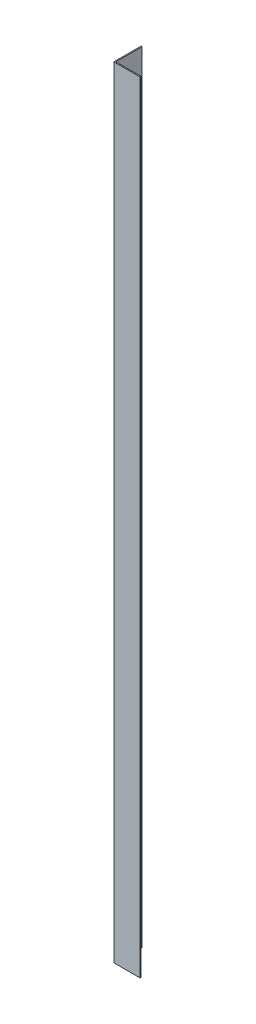
ISO-10303-21;
HEADER;
FILE_DESCRIPTION(('STEP AP214'),'2;1');
FILE_NAME('part.step','',(''),(''),'','','');
FILE_SCHEMA(('AUTOMOTIVE_DESIGN { 1 0 10303 214 1 1 1 1 }'));
ENDSEC;
DATA;
#1=APPLICATION_CONTEXT('core data for automotive mechanical design processes');
#2=APPLICATION_PROTOCOL_DEFINITION('international standard','automotive_design',2000,#1);
#3=PRODUCT_CONTEXT('',#1,'mechanical');
#4=PRODUCT('Part','Part','',(#3));
#5=PRODUCT_RELATED_PRODUCT_CATEGORY('part','',(#4));
#6=PRODUCT_DEFINITION_FORMATION('','',#4);
#7=PRODUCT_DEFINITION_CONTEXT('part definition',#1,'design');
#8=PRODUCT_DEFINITION('design','',#6,#7);
#9=PRODUCT_DEFINITION_SHAPE('','',#8);
#10=(LENGTH_UNIT() NAMED_UNIT(*) SI_UNIT(.MILLI.,.METRE.));
#11=(NAMED_UNIT(*) PLANE_ANGLE_UNIT() SI_UNIT($,.RADIAN.));
#12=(NAMED_UNIT(*) SI_UNIT($,.STERADIAN.) SOLID_ANGLE_UNIT());
#13=UNCERTAINTY_MEASURE_WITH_UNIT(LENGTH_MEASURE(1.E-05),#10,'distance_accuracy_value','');
#14=(GEOMETRIC_REPRESENTATION_CONTEXT(3) GLOBAL_UNCERTAINTY_ASSIGNED_CONTEXT((#13)) GLOBAL_UNIT_ASSIGNED_CONTEXT((#10,
#11,#12)) REPRESENTATION_CONTEXT('',''));
#15=CARTESIAN_POINT('',(0.,0.,0.));
#16=DIRECTION('',(0.,0.,1.));
#17=DIRECTION('',(1.,0.,0.));
#18=AXIS2_PLACEMENT_3D('',#15,#16,#17);
#19=CARTESIAN_POINT('',(0.,740.,-12.5));
#20=DIRECTION('',(0.,0.,-1.));
#21=DIRECTION('',(-1.,0.,0.));
#22=AXIS2_PLACEMENT_3D('',#19,#20,#21);
#23=PLANE('',#22);
#24=DIRECTION('',(1.,0.,0.));
#25=VECTOR('',#24,1.);
#26=CARTESIAN_POINT('',(0.,0.,-12.5));
#27=LINE('',#26,#25);
#28=CARTESIAN_POINT('',(-12.5000000000001,0.,-12.4999999999999));
#29=VERTEX_POINT('',#28);
#30=CARTESIAN_POINT('',(-11.5000000000001,0.,-12.4999999999999));
#31=VERTEX_POINT('',#30);
#32=EDGE_CURVE('E118',#29,#31,#27,.T.);
#33=ORIENTED_EDGE('',*,*,#32,.F.);
#34=DIRECTION('',(0.,-1.,0.));
#35=VECTOR('',#34,1.);
#36=CARTESIAN_POINT('',(-12.5000000000001,740.,-12.4999999999999));
#37=LINE('',#36,#35);
#38=CARTESIAN_POINT('',(-12.5000000000001,740.,-12.4999999999999));
#39=VERTEX_POINT('',#38);
#40=EDGE_CURVE('E11',#39,#29,#37,.T.);
#41=ORIENTED_EDGE('',*,*,#40,.F.);
#42=DIRECTION('',(1.,0.,0.));
#43=VECTOR('',#42,1.);
#44=CARTESIAN_POINT('',(0.,740.,-12.5));
#45=LINE('',#44,#43);
#46=CARTESIAN_POINT('',(-11.5000000000001,740.,-12.4999999999999));
#47=VERTEX_POINT('',#46);
#48=EDGE_CURVE('E132',#39,#47,#45,.T.);
#49=ORIENTED_EDGE('',*,*,#48,.T.);
#50=DIRECTION('',(0.,-1.,0.));
#51=VECTOR('',#50,1.);
#52=CARTESIAN_POINT('',(-11.5000000000001,740.,-12.4999999999999));
#53=LINE('',#52,#51);
#54=EDGE_CURVE('E51',#47,#31,#53,.T.);
#55=ORIENTED_EDGE('',*,*,#54,.T.);
#56=EDGE_LOOP('',(#33,#41,#49,#55));
#57=FACE_BOUND('',#56,.T.);
#58=ADVANCED_FACE('F35',(#57),#23,.T.);
#59=CARTESIAN_POINT('',(-12.5000000000001,740.,0.));
#60=DIRECTION('',(-1.,0.,0.));
#61=DIRECTION('',(0.,0.,1.));
#62=AXIS2_PLACEMENT_3D('',#59,#60,#61);
#63=PLANE('',#62);
#64=DIRECTION('',(0.,0.,-1.));
#65=VECTOR('',#64,1.);
#66=CARTESIAN_POINT('',(-12.5000000000001,0.,0.));
#67=LINE('',#66,#65);
#68=CARTESIAN_POINT('',(-12.5,0.,13.5));
#69=VERTEX_POINT('',#68);
#70=EDGE_CURVE('E120',#69,#29,#67,.T.);
#71=ORIENTED_EDGE('',*,*,#70,.F.);
#72=DIRECTION('',(0.,-1.,0.));
#73=VECTOR('',#72,1.);
#74=CARTESIAN_POINT('',(-12.5,740.,13.5));
#75=LINE('',#74,#73);
#76=CARTESIAN_POINT('',(-12.5,740.,13.5));
#77=VERTEX_POINT('',#76);
#78=EDGE_CURVE('E43',#77,#69,#75,.T.);
#79=ORIENTED_EDGE('',*,*,#78,.F.);
#80=DIRECTION('',(0.,0.,-1.));
#81=VECTOR('',#80,1.);
#82=CARTESIAN_POINT('',(-12.5000000000001,740.,0.));
#83=LINE('',#82,#81);
#84=EDGE_CURVE('E113',#77,#39,#83,.T.);
#85=ORIENTED_EDGE('',*,*,#84,.T.);
#86=ORIENTED_EDGE('',*,*,#40,.T.);
#87=EDGE_LOOP('',(#71,#79,#85,#86));
#88=FACE_BOUND('',#87,.T.);
#89=ADVANCED_FACE('F141',(#88),#63,.T.);
#90=CARTESIAN_POINT('',(-7.49400541621449E-13,740.,13.5000000000007));
#91=DIRECTION('',(0.,0.,1.));
#92=DIRECTION('',(1.,0.,0.));
#93=AXIS2_PLACEMENT_3D('',#90,#91,#92);
#94=PLANE('',#93);
#95=DIRECTION('',(-1.,0.,0.));
#96=VECTOR('',#95,1.);
#97=CARTESIAN_POINT('',(-7.49400541621449E-13,0.,13.5000000000007));
#98=LINE('',#97,#96);
#99=CARTESIAN_POINT('',(12.5,0.,13.5));
#100=VERTEX_POINT('',#99);
#101=EDGE_CURVE('E123',#100,#69,#98,.T.);
#102=ORIENTED_EDGE('',*,*,#101,.F.);
#103=DIRECTION('',(0.,-1.,0.));
#104=VECTOR('',#103,1.);
#105=CARTESIAN_POINT('',(12.5,740.,13.5));
#106=LINE('',#105,#104);
#107=CARTESIAN_POINT('',(12.5,740.,13.5));
#108=VERTEX_POINT('',#107);
#109=EDGE_CURVE('E99',#108,#100,#106,.T.);
#110=ORIENTED_EDGE('',*,*,#109,.F.);
#111=DIRECTION('',(-1.,0.,0.));
#112=VECTOR('',#111,1.);
#113=CARTESIAN_POINT('',(-7.49400541621449E-13,740.,13.5000000000007));
#114=LINE('',#113,#112);
#115=EDGE_CURVE('E111',#108,#77,#114,.T.);
#116=ORIENTED_EDGE('',*,*,#115,.T.);
#117=ORIENTED_EDGE('',*,*,#78,.T.);
#118=EDGE_LOOP('',(#102,#110,#116,#117));
#119=FACE_BOUND('',#118,.T.);
#120=ADVANCED_FACE('F138',(#119),#94,.T.);
#121=CARTESIAN_POINT('',(12.5000000000007,740.,6.28837260041593E-13));
#122=DIRECTION('',(1.,0.,0.));
#123=DIRECTION('',(0.,0.,-1.));
#124=AXIS2_PLACEMENT_3D('',#121,#122,#123);
#125=PLANE('',#124);
#126=DIRECTION('',(0.,0.,1.));
#127=VECTOR('',#126,1.);
#128=CARTESIAN_POINT('',(12.5000000000007,0.,6.28837260041593E-13));
#129=LINE('',#128,#127);
#130=CARTESIAN_POINT('',(12.5000000000001,0.,12.4999999999999));
#131=VERTEX_POINT('',#130);
#132=EDGE_CURVE('E96',#131,#100,#129,.T.);
#133=ORIENTED_EDGE('',*,*,#132,.F.);
#134=DIRECTION('',(0.,-1.,0.));
#135=VECTOR('',#134,1.);
#136=CARTESIAN_POINT('',(12.5000000000001,740.,12.4999999999999));
#137=LINE('',#136,#135);
#138=CARTESIAN_POINT('',(12.5000000000001,740.,12.4999999999999));
#139=VERTEX_POINT('',#138);
#140=EDGE_CURVE('E90',#139,#131,#137,.T.);
#141=ORIENTED_EDGE('',*,*,#140,.F.);
#142=DIRECTION('',(0.,0.,1.));
#143=VECTOR('',#142,1.);
#144=CARTESIAN_POINT('',(12.5000000000007,740.,6.28837260041593E-13));
#145=LINE('',#144,#143);
#146=EDGE_CURVE('E94',#139,#108,#145,.T.);
#147=ORIENTED_EDGE('',*,*,#146,.T.);
#148=ORIENTED_EDGE('',*,*,#109,.T.);
#149=EDGE_LOOP('',(#133,#141,#147,#148));
#150=FACE_BOUND('',#149,.T.);
#151=ADVANCED_FACE('F92',(#150),#125,.T.);
#152=CARTESIAN_POINT('',(0.,740.,12.5));
#153=DIRECTION('',(0.,0.,1.));
#154=DIRECTION('',(1.,0.,0.));
#155=AXIS2_PLACEMENT_3D('',#152,#153,#154);
#156=PLANE('',#155);
#157=DIRECTION('',(-1.,0.,0.));
#158=VECTOR('',#157,1.);
#159=CARTESIAN_POINT('',(0.,0.,12.5));
#160=LINE('',#159,#158);
#161=CARTESIAN_POINT('',(-11.5,0.,12.5));
#162=VERTEX_POINT('',#161);
#163=EDGE_CURVE('E127',#131,#162,#160,.T.);
#164=ORIENTED_EDGE('',*,*,#163,.T.);
#165=DIRECTION('',(0.,-1.,0.));
#166=VECTOR('',#165,1.);
#167=CARTESIAN_POINT('',(-11.5,740.,12.5));
#168=LINE('',#167,#166);
#169=CARTESIAN_POINT('',(-11.5,740.,12.5));
#170=VERTEX_POINT('',#169);
#171=EDGE_CURVE('E71',#170,#162,#168,.T.);
#172=ORIENTED_EDGE('',*,*,#171,.F.);
#173=DIRECTION('',(-1.,0.,0.));
#174=VECTOR('',#173,1.);
#175=CARTESIAN_POINT('',(0.,740.,12.5));
#176=LINE('',#175,#174);
#177=EDGE_CURVE('E101',#139,#170,#176,.T.);
#178=ORIENTED_EDGE('',*,*,#177,.F.);
#179=ORIENTED_EDGE('',*,*,#140,.T.);
#180=EDGE_LOOP('',(#164,#172,#178,#179));
#181=FACE_BOUND('',#180,.T.);
#182=ADVANCED_FACE('F102',(#181),#156,.F.);
#183=CARTESIAN_POINT('',(-11.5,740.,0.));
#184=DIRECTION('',(1.,0.,0.));
#185=DIRECTION('',(0.,0.,-1.));
#186=AXIS2_PLACEMENT_3D('',#183,#184,#185);
#187=PLANE('',#186);
#188=DIRECTION('',(0.,0.,1.));
#189=VECTOR('',#188,1.);
#190=CARTESIAN_POINT('',(-11.5,0.,0.));
#191=LINE('',#190,#189);
#192=EDGE_CURVE('E129',#31,#162,#191,.T.);
#193=ORIENTED_EDGE('',*,*,#192,.F.);
#194=ORIENTED_EDGE('',*,*,#54,.F.);
#195=DIRECTION('',(0.,0.,1.));
#196=VECTOR('',#195,1.);
#197=CARTESIAN_POINT('',(-11.5,740.,0.));
#198=LINE('',#197,#196);
#199=EDGE_CURVE('E105',#47,#170,#198,.T.);
#200=ORIENTED_EDGE('',*,*,#199,.T.);
#201=ORIENTED_EDGE('',*,*,#171,.T.);
#202=EDGE_LOOP('',(#193,#194,#200,#201));
#203=FACE_BOUND('',#202,.T.);
#204=ADVANCED_FACE('F144',(#203),#187,.T.);
#205=CARTESIAN_POINT('',(0.,740.,0.));
#206=DIRECTION('',(0.,1.,0.));
#207=DIRECTION('',(0.,0.,1.));
#208=AXIS2_PLACEMENT_3D('',#205,#206,#207);
#209=PLANE('',#208);
#210=ORIENTED_EDGE('',*,*,#48,.F.);
#211=ORIENTED_EDGE('',*,*,#84,.F.);
#212=ORIENTED_EDGE('',*,*,#115,.F.);
#213=ORIENTED_EDGE('',*,*,#146,.F.);
#214=ORIENTED_EDGE('',*,*,#177,.T.);
#215=ORIENTED_EDGE('',*,*,#199,.F.);
#216=EDGE_LOOP('',(#210,#211,#212,#213,#214,#215));
#217=FACE_BOUND('',#216,.T.);
#218=ADVANCED_FACE('F108',(#217),#209,.T.);
#219=CARTESIAN_POINT('',(0.,0.,0.));
#220=DIRECTION('',(0.,1.,0.));
#221=DIRECTION('',(0.,0.,1.));
#222=AXIS2_PLACEMENT_3D('',#219,#220,#221);
#223=PLANE('',#222);
#224=ORIENTED_EDGE('',*,*,#32,.T.);
#225=ORIENTED_EDGE('',*,*,#192,.T.);
#226=ORIENTED_EDGE('',*,*,#163,.F.);
#227=ORIENTED_EDGE('',*,*,#132,.T.);
#228=ORIENTED_EDGE('',*,*,#101,.T.);
#229=ORIENTED_EDGE('',*,*,#70,.T.);
#230=EDGE_LOOP('',(#224,#225,#226,#227,#228,#229));
#231=FACE_BOUND('',#230,.T.);
#232=ADVANCED_FACE('F143',(#231),#223,.F.);
#233=CLOSED_SHELL('',(#58,#89,#120,#151,#182,#204,#218,#232));
#234=MANIFOLD_SOLID_BREP('B2',#233);
#235=ADVANCED_BREP_SHAPE_REPRESENTATION('',(#18,#234),#14);
#236=SHAPE_DEFINITION_REPRESENTATION(#9,#235);
ENDSEC;
END-ISO-10303-21;
